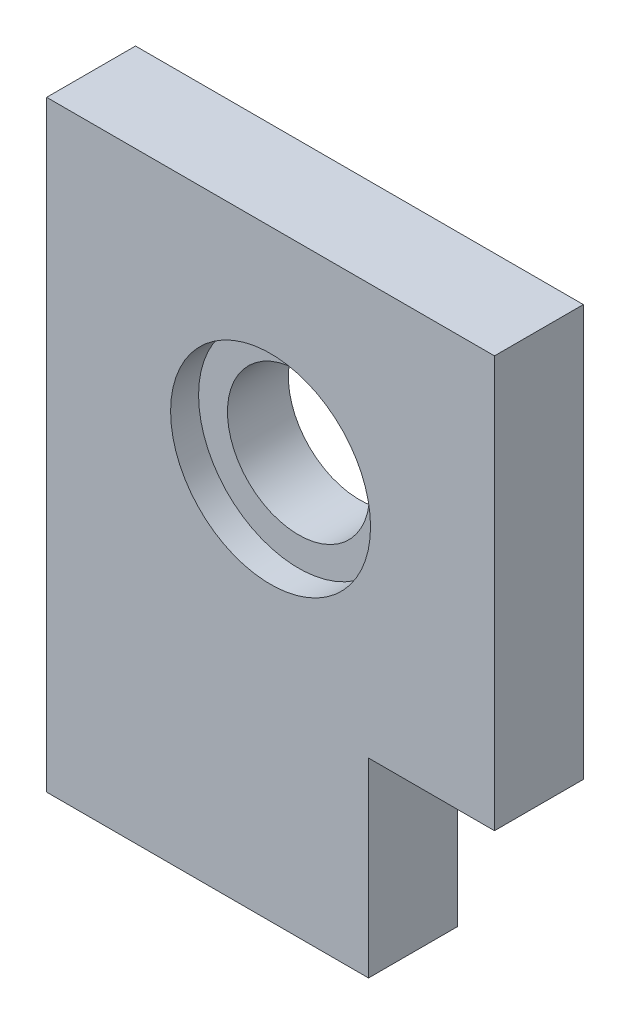
ISO-10303-21;
HEADER;
FILE_DESCRIPTION(('STEP AP214'),'2;1');
FILE_NAME('part.step','',(''),(''),'','','');
FILE_SCHEMA(('AUTOMOTIVE_DESIGN { 1 0 10303 214 1 1 1 1 }'));
ENDSEC;
DATA;
#1=APPLICATION_CONTEXT('core data for automotive mechanical design processes');
#2=APPLICATION_PROTOCOL_DEFINITION('international standard','automotive_design',2000,#1);
#3=PRODUCT_CONTEXT('',#1,'mechanical');
#4=PRODUCT('Part','Part','',(#3));
#5=PRODUCT_RELATED_PRODUCT_CATEGORY('part','',(#4));
#6=PRODUCT_DEFINITION_FORMATION('','',#4);
#7=PRODUCT_DEFINITION_CONTEXT('part definition',#1,'design');
#8=PRODUCT_DEFINITION('design','',#6,#7);
#9=PRODUCT_DEFINITION_SHAPE('','',#8);
#10=(LENGTH_UNIT() NAMED_UNIT(*) SI_UNIT(.MILLI.,.METRE.));
#11=(NAMED_UNIT(*) PLANE_ANGLE_UNIT() SI_UNIT($,.RADIAN.));
#12=(NAMED_UNIT(*) SI_UNIT($,.STERADIAN.) SOLID_ANGLE_UNIT());
#13=UNCERTAINTY_MEASURE_WITH_UNIT(LENGTH_MEASURE(1.E-05),#10,'distance_accuracy_value','');
#14=(GEOMETRIC_REPRESENTATION_CONTEXT(3) GLOBAL_UNCERTAINTY_ASSIGNED_CONTEXT((#13)) GLOBAL_UNIT_ASSIGNED_CONTEXT((#10,
#11,#12)) REPRESENTATION_CONTEXT('',''));
#15=CARTESIAN_POINT('',(0.,0.,0.));
#16=DIRECTION('',(0.,0.,1.));
#17=DIRECTION('',(1.,0.,0.));
#18=AXIS2_PLACEMENT_3D('',#15,#16,#17);
#19=CARTESIAN_POINT('',(0.,0.,12.7));
#20=DIRECTION('',(0.,0.,-1.));
#21=DIRECTION('',(-1.,0.,0.));
#22=AXIS2_PLACEMENT_3D('',#19,#20,#21);
#23=CYLINDRICAL_SURFACE('',#22,10.16);
#24=CARTESIAN_POINT('',(0.,0.,0.));
#25=DIRECTION('',(0.,0.,1.));
#26=DIRECTION('',(1.,0.,0.));
#27=AXIS2_PLACEMENT_3D('',#24,#25,#26);
#28=CIRCLE('',#27,10.16);
#29=CARTESIAN_POINT('',(10.16,0.,0.));
#30=VERTEX_POINT('',#29);
#31=EDGE_CURVE('E122',#30,#30,#28,.T.);
#32=ORIENTED_EDGE('',*,*,#31,.F.);
#33=EDGE_LOOP('',(#32));
#34=FACE_BOUND('',#33,.T.);
#35=CARTESIAN_POINT('',(0.,0.,8.7));
#36=DIRECTION('',(0.,0.,1.));
#37=DIRECTION('',(1.,0.,0.));
#38=AXIS2_PLACEMENT_3D('',#35,#36,#37);
#39=CIRCLE('',#38,10.16);
#40=CARTESIAN_POINT('',(10.16,0.,8.7));
#41=VERTEX_POINT('',#40);
#42=EDGE_CURVE('E37',#41,#41,#39,.T.);
#43=ORIENTED_EDGE('',*,*,#42,.T.);
#44=EDGE_LOOP('',(#43));
#45=FACE_BOUND('',#44,.T.);
#46=ADVANCED_FACE('F33',(#34,#45),#23,.F.);
#47=CARTESIAN_POINT('',(0.,0.,12.7));
#48=DIRECTION('',(0.,0.,1.));
#49=DIRECTION('',(1.,0.,0.));
#50=AXIS2_PLACEMENT_3D('',#47,#48,#49);
#51=PLANE('',#50);
#52=CARTESIAN_POINT('',(0.,0.,12.7));
#53=DIRECTION('',(0.,0.,1.));
#54=DIRECTION('',(1.,0.,0.));
#55=AXIS2_PLACEMENT_3D('',#52,#53,#54);
#56=CIRCLE('',#55,14.2875);
#57=CARTESIAN_POINT('',(14.2875,0.,12.7));
#58=VERTEX_POINT('',#57);
#59=EDGE_CURVE('E230',#58,#58,#56,.T.);
#60=ORIENTED_EDGE('',*,*,#59,.F.);
#61=EDGE_LOOP('',(#60));
#62=FACE_BOUND('',#61,.T.);
#63=DIRECTION('',(1.,0.,0.));
#64=VECTOR('',#63,1.);
#65=CARTESIAN_POINT('',(14.,-28.7749891398763,12.7));
#66=LINE('',#65,#64);
#67=CARTESIAN_POINT('',(14.,-28.7749891398763,12.7));
#68=VERTEX_POINT('',#67);
#69=CARTESIAN_POINT('',(32.,-28.7749891398763,12.7));
#70=VERTEX_POINT('',#69);
#71=EDGE_CURVE('E130',#68,#70,#66,.T.);
#72=ORIENTED_EDGE('',*,*,#71,.T.);
#73=DIRECTION('',(0.,1.,0.));
#74=VECTOR('',#73,1.);
#75=CARTESIAN_POINT('',(32.,-28.7749891398763,12.7));
#76=LINE('',#75,#74);
#77=CARTESIAN_POINT('',(32.,30.,12.7));
#78=VERTEX_POINT('',#77);
#79=EDGE_CURVE('E88',#70,#78,#76,.T.);
#80=ORIENTED_EDGE('',*,*,#79,.T.);
#81=DIRECTION('',(-1.,0.,0.));
#82=VECTOR('',#81,1.);
#83=CARTESIAN_POINT('',(32.,30.,12.7));
#84=LINE('',#83,#82);
#85=CARTESIAN_POINT('',(-32.,30.,12.7));
#86=VERTEX_POINT('',#85);
#87=EDGE_CURVE('E101',#78,#86,#84,.T.);
#88=ORIENTED_EDGE('',*,*,#87,.T.);
#89=DIRECTION('',(0.,-1.,0.));
#90=VECTOR('',#89,1.);
#91=CARTESIAN_POINT('',(-32.,30.,12.7));
#92=LINE('',#91,#90);
#93=CARTESIAN_POINT('',(-32.,-56.,12.7));
#94=VERTEX_POINT('',#93);
#95=EDGE_CURVE('E95',#86,#94,#92,.T.);
#96=ORIENTED_EDGE('',*,*,#95,.T.);
#97=DIRECTION('',(1.,0.,0.));
#98=VECTOR('',#97,1.);
#99=CARTESIAN_POINT('',(14.,-56.,12.7));
#100=LINE('',#99,#98);
#101=CARTESIAN_POINT('',(14.,-56.,12.7));
#102=VERTEX_POINT('',#101);
#103=EDGE_CURVE('E99',#94,#102,#100,.T.);
#104=ORIENTED_EDGE('',*,*,#103,.T.);
#105=DIRECTION('',(0.,1.,0.));
#106=VECTOR('',#105,1.);
#107=CARTESIAN_POINT('',(14.,-56.,12.7));
#108=LINE('',#107,#106);
#109=EDGE_CURVE('E51',#102,#68,#108,.T.);
#110=ORIENTED_EDGE('',*,*,#109,.T.);
#111=EDGE_LOOP('',(#72,#80,#88,#96,#104,#110));
#112=FACE_BOUND('',#111,.T.);
#113=ADVANCED_FACE('F97',(#62,#112),#51,.T.);
#114=CARTESIAN_POINT('',(0.,0.,0.));
#115=DIRECTION('',(0.,0.,1.));
#116=DIRECTION('',(1.,0.,0.));
#117=AXIS2_PLACEMENT_3D('',#114,#115,#116);
#118=PLANE('',#117);
#119=DIRECTION('',(1.,0.,0.));
#120=VECTOR('',#119,1.);
#121=CARTESIAN_POINT('',(14.,-28.7749891398763,0.));
#122=LINE('',#121,#120);
#123=CARTESIAN_POINT('',(14.,-28.7749891398763,0.));
#124=VERTEX_POINT('',#123);
#125=CARTESIAN_POINT('',(32.,-28.7749891398763,0.));
#126=VERTEX_POINT('',#125);
#127=EDGE_CURVE('E118',#124,#126,#122,.T.);
#128=ORIENTED_EDGE('',*,*,#127,.F.);
#129=DIRECTION('',(0.,1.,0.));
#130=VECTOR('',#129,1.);
#131=CARTESIAN_POINT('',(14.,-56.,0.));
#132=LINE('',#131,#130);
#133=CARTESIAN_POINT('',(14.,-56.,0.));
#134=VERTEX_POINT('',#133);
#135=EDGE_CURVE('E80',#134,#124,#132,.T.);
#136=ORIENTED_EDGE('',*,*,#135,.F.);
#137=DIRECTION('',(1.,0.,0.));
#138=VECTOR('',#137,1.);
#139=CARTESIAN_POINT('',(14.,-56.,0.));
#140=LINE('',#139,#138);
#141=CARTESIAN_POINT('',(-32.,-56.,0.));
#142=VERTEX_POINT('',#141);
#143=EDGE_CURVE('E74',#142,#134,#140,.T.);
#144=ORIENTED_EDGE('',*,*,#143,.F.);
#145=DIRECTION('',(0.,-1.,0.));
#146=VECTOR('',#145,1.);
#147=CARTESIAN_POINT('',(-32.,-56.,0.));
#148=LINE('',#147,#146);
#149=CARTESIAN_POINT('',(-32.,30.,0.));
#150=VERTEX_POINT('',#149);
#151=EDGE_CURVE('E108',#150,#142,#148,.T.);
#152=ORIENTED_EDGE('',*,*,#151,.F.);
#153=DIRECTION('',(-1.,0.,0.));
#154=VECTOR('',#153,1.);
#155=CARTESIAN_POINT('',(32.,30.,0.));
#156=LINE('',#155,#154);
#157=CARTESIAN_POINT('',(32.,30.,0.));
#158=VERTEX_POINT('',#157);
#159=EDGE_CURVE('E124',#158,#150,#156,.T.);
#160=ORIENTED_EDGE('',*,*,#159,.F.);
#161=DIRECTION('',(0.,1.,0.));
#162=VECTOR('',#161,1.);
#163=CARTESIAN_POINT('',(32.,-28.7749891398763,0.));
#164=LINE('',#163,#162);
#165=EDGE_CURVE('E121',#126,#158,#164,.T.);
#166=ORIENTED_EDGE('',*,*,#165,.F.);
#167=EDGE_LOOP('',(#128,#136,#144,#152,#160,#166));
#168=FACE_BOUND('',#167,.T.);
#169=ORIENTED_EDGE('',*,*,#31,.T.);
#170=EDGE_LOOP('',(#169));
#171=FACE_BOUND('',#170,.T.);
#172=ADVANCED_FACE('F140',(#168,#171),#118,.F.);
#173=CARTESIAN_POINT('',(14.,-28.7749891398763,12.7));
#174=DIRECTION('',(0.,1.,0.));
#175=DIRECTION('',(0.,0.,1.));
#176=AXIS2_PLACEMENT_3D('',#173,#174,#175);
#177=PLANE('',#176);
#178=ORIENTED_EDGE('',*,*,#127,.T.);
#179=DIRECTION('',(0.,0.,-1.));
#180=VECTOR('',#179,1.);
#181=CARTESIAN_POINT('',(32.,-28.7749891398763,12.7));
#182=LINE('',#181,#180);
#183=EDGE_CURVE('E11',#70,#126,#182,.T.);
#184=ORIENTED_EDGE('',*,*,#183,.F.);
#185=ORIENTED_EDGE('',*,*,#71,.F.);
#186=DIRECTION('',(0.,0.,-1.));
#187=VECTOR('',#186,1.);
#188=CARTESIAN_POINT('',(14.,-28.7749891398763,12.7));
#189=LINE('',#188,#187);
#190=EDGE_CURVE('E114',#68,#124,#189,.T.);
#191=ORIENTED_EDGE('',*,*,#190,.T.);
#192=EDGE_LOOP('',(#178,#184,#185,#191));
#193=FACE_BOUND('',#192,.T.);
#194=ADVANCED_FACE('F35',(#193),#177,.F.);
#195=CARTESIAN_POINT('',(32.,-28.7749891398763,12.7));
#196=DIRECTION('',(-1.,0.,0.));
#197=DIRECTION('',(0.,-1.,0.));
#198=AXIS2_PLACEMENT_3D('',#195,#196,#197);
#199=PLANE('',#198);
#200=ORIENTED_EDGE('',*,*,#165,.T.);
#201=DIRECTION('',(0.,0.,-1.));
#202=VECTOR('',#201,1.);
#203=CARTESIAN_POINT('',(32.,30.,12.7));
#204=LINE('',#203,#202);
#205=EDGE_CURVE('E43',#78,#158,#204,.T.);
#206=ORIENTED_EDGE('',*,*,#205,.F.);
#207=ORIENTED_EDGE('',*,*,#79,.F.);
#208=ORIENTED_EDGE('',*,*,#183,.T.);
#209=EDGE_LOOP('',(#200,#206,#207,#208));
#210=FACE_BOUND('',#209,.T.);
#211=ADVANCED_FACE('F173',(#210),#199,.F.);
#212=CARTESIAN_POINT('',(32.,30.,12.7));
#213=DIRECTION('',(0.,-1.,0.));
#214=DIRECTION('',(1.,0.,0.));
#215=AXIS2_PLACEMENT_3D('',#212,#213,#214);
#216=PLANE('',#215);
#217=ORIENTED_EDGE('',*,*,#159,.T.);
#218=DIRECTION('',(0.,0.,-1.));
#219=VECTOR('',#218,1.);
#220=CARTESIAN_POINT('',(-32.,30.,12.7));
#221=LINE('',#220,#219);
#222=EDGE_CURVE('E109',#86,#150,#221,.T.);
#223=ORIENTED_EDGE('',*,*,#222,.F.);
#224=ORIENTED_EDGE('',*,*,#87,.F.);
#225=ORIENTED_EDGE('',*,*,#205,.T.);
#226=EDGE_LOOP('',(#217,#223,#224,#225));
#227=FACE_BOUND('',#226,.T.);
#228=ADVANCED_FACE('F137',(#227),#216,.F.);
#229=CARTESIAN_POINT('',(-32.,-56.,12.7));
#230=DIRECTION('',(1.,0.,0.));
#231=DIRECTION('',(0.,1.,0.));
#232=AXIS2_PLACEMENT_3D('',#229,#230,#231);
#233=PLANE('',#232);
#234=ORIENTED_EDGE('',*,*,#151,.T.);
#235=DIRECTION('',(0.,0.,-1.));
#236=VECTOR('',#235,1.);
#237=CARTESIAN_POINT('',(-32.,-56.,12.7));
#238=LINE('',#237,#236);
#239=EDGE_CURVE('E106',#94,#142,#238,.T.);
#240=ORIENTED_EDGE('',*,*,#239,.F.);
#241=ORIENTED_EDGE('',*,*,#95,.F.);
#242=ORIENTED_EDGE('',*,*,#222,.T.);
#243=EDGE_LOOP('',(#234,#240,#241,#242));
#244=FACE_BOUND('',#243,.T.);
#245=ADVANCED_FACE('F107',(#244),#233,.F.);
#246=CARTESIAN_POINT('',(14.,-56.,12.7));
#247=DIRECTION('',(0.,1.,0.));
#248=DIRECTION('',(-1.,0.,0.));
#249=AXIS2_PLACEMENT_3D('',#246,#247,#248);
#250=PLANE('',#249);
#251=ORIENTED_EDGE('',*,*,#143,.T.);
#252=DIRECTION('',(0.,0.,-1.));
#253=VECTOR('',#252,1.);
#254=CARTESIAN_POINT('',(14.,-56.,12.7));
#255=LINE('',#254,#253);
#256=EDGE_CURVE('E110',#102,#134,#255,.T.);
#257=ORIENTED_EDGE('',*,*,#256,.F.);
#258=ORIENTED_EDGE('',*,*,#103,.F.);
#259=ORIENTED_EDGE('',*,*,#239,.T.);
#260=EDGE_LOOP('',(#251,#257,#258,#259));
#261=FACE_BOUND('',#260,.T.);
#262=ADVANCED_FACE('F112',(#261),#250,.F.);
#263=CARTESIAN_POINT('',(14.,-56.,12.7));
#264=DIRECTION('',(-1.,0.,0.));
#265=DIRECTION('',(0.,0.,1.));
#266=AXIS2_PLACEMENT_3D('',#263,#264,#265);
#267=PLANE('',#266);
#268=ORIENTED_EDGE('',*,*,#135,.T.);
#269=ORIENTED_EDGE('',*,*,#190,.F.);
#270=ORIENTED_EDGE('',*,*,#109,.F.);
#271=ORIENTED_EDGE('',*,*,#256,.T.);
#272=EDGE_LOOP('',(#268,#269,#270,#271));
#273=FACE_BOUND('',#272,.T.);
#274=ADVANCED_FACE('F145',(#273),#267,.F.);
#275=CARTESIAN_POINT('',(0.,0.,8.7));
#276=DIRECTION('',(0.,0.,1.));
#277=DIRECTION('',(1.,0.,0.));
#278=AXIS2_PLACEMENT_3D('',#275,#276,#277);
#279=CYLINDRICAL_SURFACE('',#278,14.2875);
#280=CARTESIAN_POINT('',(0.,0.,8.7));
#281=DIRECTION('',(0.,0.,1.));
#282=DIRECTION('',(1.,0.,0.));
#283=AXIS2_PLACEMENT_3D('',#280,#281,#282);
#284=CIRCLE('',#283,14.2875);
#285=CARTESIAN_POINT('',(14.2875,0.,8.7));
#286=VERTEX_POINT('',#285);
#287=EDGE_CURVE('E229',#286,#286,#284,.T.);
#288=ORIENTED_EDGE('',*,*,#287,.F.);
#289=EDGE_LOOP('',(#288));
#290=FACE_BOUND('',#289,.T.);
#291=ORIENTED_EDGE('',*,*,#59,.T.);
#292=EDGE_LOOP('',(#291));
#293=FACE_BOUND('',#292,.T.);
#294=ADVANCED_FACE('F147',(#290,#293),#279,.F.);
#295=CARTESIAN_POINT('',(0.,0.,8.7));
#296=DIRECTION('',(0.,0.,1.));
#297=DIRECTION('',(1.,0.,0.));
#298=AXIS2_PLACEMENT_3D('',#295,#296,#297);
#299=PLANE('',#298);
#300=ORIENTED_EDGE('',*,*,#42,.F.);
#301=EDGE_LOOP('',(#300));
#302=FACE_BOUND('',#301,.T.);
#303=ORIENTED_EDGE('',*,*,#287,.T.);
#304=EDGE_LOOP('',(#303));
#305=FACE_BOUND('',#304,.T.);
#306=ADVANCED_FACE('F153',(#302,#305),#299,.T.);
#307=CLOSED_SHELL('',(#46,#113,#172,#194,#211,#228,#245,#262,#274,#294,#306));
#308=MANIFOLD_SOLID_BREP('B2',#307);
#309=ADVANCED_BREP_SHAPE_REPRESENTATION('',(#18,#308),#14);
#310=SHAPE_DEFINITION_REPRESENTATION(#9,#309);
ENDSEC;
END-ISO-10303-21;
